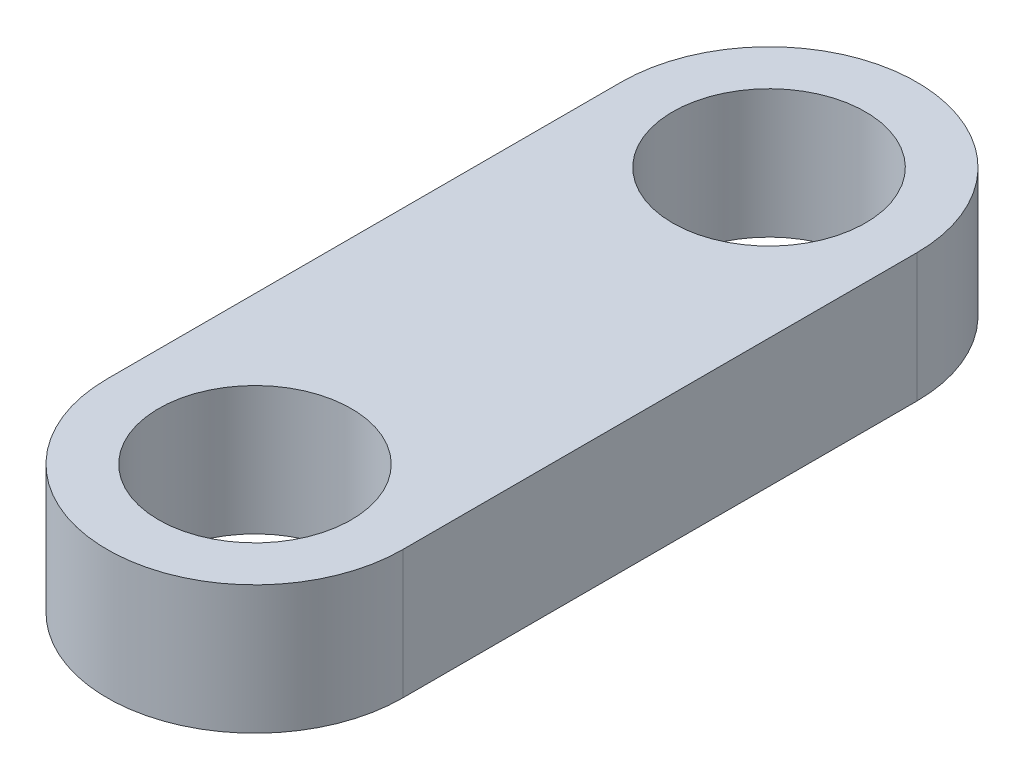
ISO-10303-21;
HEADER;
FILE_DESCRIPTION(('STEP AP214'),'2;1');
FILE_NAME('part.step','',(''),(''),'','','');
FILE_SCHEMA(('AUTOMOTIVE_DESIGN { 1 0 10303 214 1 1 1 1 }'));
ENDSEC;
DATA;
#1=APPLICATION_CONTEXT('core data for automotive mechanical design processes');
#2=APPLICATION_PROTOCOL_DEFINITION('international standard','automotive_design',2000,#1);
#3=PRODUCT_CONTEXT('',#1,'mechanical');
#4=PRODUCT('Part','Part','',(#3));
#5=PRODUCT_RELATED_PRODUCT_CATEGORY('part','',(#4));
#6=PRODUCT_DEFINITION_FORMATION('','',#4);
#7=PRODUCT_DEFINITION_CONTEXT('part definition',#1,'design');
#8=PRODUCT_DEFINITION('design','',#6,#7);
#9=PRODUCT_DEFINITION_SHAPE('','',#8);
#10=(LENGTH_UNIT() NAMED_UNIT(*) SI_UNIT(.MILLI.,.METRE.));
#11=(NAMED_UNIT(*) PLANE_ANGLE_UNIT() SI_UNIT($,.RADIAN.));
#12=(NAMED_UNIT(*) SI_UNIT($,.STERADIAN.) SOLID_ANGLE_UNIT());
#13=UNCERTAINTY_MEASURE_WITH_UNIT(LENGTH_MEASURE(1.E-05),#10,'distance_accuracy_value','');
#14=(GEOMETRIC_REPRESENTATION_CONTEXT(3) GLOBAL_UNCERTAINTY_ASSIGNED_CONTEXT((#13)) GLOBAL_UNIT_ASSIGNED_CONTEXT((#10,
#11,#12)) REPRESENTATION_CONTEXT('',''));
#15=CARTESIAN_POINT('',(0.,0.,0.));
#16=DIRECTION('',(0.,0.,1.));
#17=DIRECTION('',(1.,0.,0.));
#18=AXIS2_PLACEMENT_3D('',#15,#16,#17);
#19=CARTESIAN_POINT('',(0.,5.,0.));
#20=DIRECTION('',(0.,1.,0.));
#21=DIRECTION('',(0.,0.,1.));
#22=AXIS2_PLACEMENT_3D('',#19,#20,#21);
#23=PLANE('',#22);
#24=DIRECTION('',(0.,0.,1.));
#25=VECTOR('',#24,1.);
#26=CARTESIAN_POINT('',(5.75,5.,0.));
#27=LINE('',#26,#25);
#28=CARTESIAN_POINT('',(5.75,5.,-20.));
#29=VERTEX_POINT('',#28);
#30=CARTESIAN_POINT('',(5.75,5.,0.));
#31=VERTEX_POINT('',#30);
#32=EDGE_CURVE('E112',#29,#31,#27,.T.);
#33=ORIENTED_EDGE('',*,*,#32,.F.);
#34=CARTESIAN_POINT('',(0.,5.,-20.));
#35=DIRECTION('',(0.,1.,0.));
#36=DIRECTION('',(0.,0.,1.));
#37=AXIS2_PLACEMENT_3D('',#34,#35,#36);
#38=CIRCLE('',#37,5.75);
#39=CARTESIAN_POINT('',(-5.75,5.,-20.));
#40=VERTEX_POINT('',#39);
#41=EDGE_CURVE('E107',#29,#40,#38,.T.);
#42=ORIENTED_EDGE('',*,*,#41,.T.);
#43=DIRECTION('',(0.,0.,-1.));
#44=VECTOR('',#43,1.);
#45=CARTESIAN_POINT('',(-5.75,5.,0.));
#46=LINE('',#45,#44);
#47=CARTESIAN_POINT('',(-5.75,5.,0.));
#48=VERTEX_POINT('',#47);
#49=EDGE_CURVE('E111',#48,#40,#46,.T.);
#50=ORIENTED_EDGE('',*,*,#49,.F.);
#51=CARTESIAN_POINT('',(0.,5.,0.));
#52=DIRECTION('',(0.,1.,0.));
#53=DIRECTION('',(0.,0.,1.));
#54=AXIS2_PLACEMENT_3D('',#51,#52,#53);
#55=CIRCLE('',#54,5.75);
#56=EDGE_CURVE('E80',#48,#31,#55,.T.);
#57=ORIENTED_EDGE('',*,*,#56,.T.);
#58=EDGE_LOOP('',(#33,#42,#50,#57));
#59=FACE_BOUND('',#58,.T.);
#60=CARTESIAN_POINT('',(0.,5.,-20.));
#61=DIRECTION('',(0.,1.,0.));
#62=DIRECTION('',(0.,0.,1.));
#63=AXIS2_PLACEMENT_3D('',#60,#61,#62);
#64=CIRCLE('',#63,3.75);
#65=CARTESIAN_POINT('',(0.,5.,-16.25));
#66=VERTEX_POINT('',#65);
#67=EDGE_CURVE('E148',#66,#66,#64,.T.);
#68=ORIENTED_EDGE('',*,*,#67,.F.);
#69=EDGE_LOOP('',(#68));
#70=FACE_BOUND('',#69,.T.);
#71=CARTESIAN_POINT('',(0.,5.,0.));
#72=DIRECTION('',(0.,1.,0.));
#73=DIRECTION('',(0.,0.,1.));
#74=AXIS2_PLACEMENT_3D('',#71,#72,#73);
#75=CIRCLE('',#74,3.75);
#76=CARTESIAN_POINT('',(0.,5.,3.75));
#77=VERTEX_POINT('',#76);
#78=EDGE_CURVE('E136',#77,#77,#75,.T.);
#79=ORIENTED_EDGE('',*,*,#78,.F.);
#80=EDGE_LOOP('',(#79));
#81=FACE_BOUND('',#80,.T.);
#82=ADVANCED_FACE('F62',(#59,#70,#81),#23,.T.);
#83=CARTESIAN_POINT('',(0.,0.,0.));
#84=DIRECTION('',(0.,1.,0.));
#85=DIRECTION('',(0.,0.,1.));
#86=AXIS2_PLACEMENT_3D('',#83,#84,#85);
#87=PLANE('',#86);
#88=CARTESIAN_POINT('',(0.,0.,-20.));
#89=DIRECTION('',(0.,1.,0.));
#90=DIRECTION('',(0.,0.,1.));
#91=AXIS2_PLACEMENT_3D('',#88,#89,#90);
#92=CIRCLE('',#91,3.75);
#93=CARTESIAN_POINT('',(0.,0.,-16.25));
#94=VERTEX_POINT('',#93);
#95=EDGE_CURVE('E131',#94,#94,#92,.T.);
#96=ORIENTED_EDGE('',*,*,#95,.T.);
#97=EDGE_LOOP('',(#96));
#98=FACE_BOUND('',#97,.T.);
#99=DIRECTION('',(0.,0.,1.));
#100=VECTOR('',#99,1.);
#101=CARTESIAN_POINT('',(5.75,0.,0.));
#102=LINE('',#101,#100);
#103=CARTESIAN_POINT('',(5.75,0.,-20.));
#104=VERTEX_POINT('',#103);
#105=CARTESIAN_POINT('',(5.75,0.,0.));
#106=VERTEX_POINT('',#105);
#107=EDGE_CURVE('E135',#104,#106,#102,.T.);
#108=ORIENTED_EDGE('',*,*,#107,.T.);
#109=CARTESIAN_POINT('',(0.,0.,0.));
#110=DIRECTION('',(0.,1.,0.));
#111=DIRECTION('',(0.,0.,1.));
#112=AXIS2_PLACEMENT_3D('',#109,#110,#111);
#113=CIRCLE('',#112,5.75);
#114=CARTESIAN_POINT('',(-5.75,0.,0.));
#115=VERTEX_POINT('',#114);
#116=EDGE_CURVE('E145',#115,#106,#113,.T.);
#117=ORIENTED_EDGE('',*,*,#116,.F.);
#118=DIRECTION('',(0.,0.,-1.));
#119=VECTOR('',#118,1.);
#120=CARTESIAN_POINT('',(-5.75,0.,0.));
#121=LINE('',#120,#119);
#122=CARTESIAN_POINT('',(-5.75,0.,-20.));
#123=VERTEX_POINT('',#122);
#124=EDGE_CURVE('E142',#115,#123,#121,.T.);
#125=ORIENTED_EDGE('',*,*,#124,.T.);
#126=CARTESIAN_POINT('',(0.,0.,-20.));
#127=DIRECTION('',(0.,1.,0.));
#128=DIRECTION('',(0.,0.,1.));
#129=AXIS2_PLACEMENT_3D('',#126,#127,#128);
#130=CIRCLE('',#129,5.75);
#131=EDGE_CURVE('E119',#104,#123,#130,.T.);
#132=ORIENTED_EDGE('',*,*,#131,.F.);
#133=EDGE_LOOP('',(#108,#117,#125,#132));
#134=FACE_BOUND('',#133,.T.);
#135=CARTESIAN_POINT('',(0.,0.,0.));
#136=DIRECTION('',(0.,1.,0.));
#137=DIRECTION('',(0.,0.,1.));
#138=AXIS2_PLACEMENT_3D('',#135,#136,#137);
#139=CIRCLE('',#138,3.75);
#140=CARTESIAN_POINT('',(0.,0.,3.75));
#141=VERTEX_POINT('',#140);
#142=EDGE_CURVE('E159',#141,#141,#139,.T.);
#143=ORIENTED_EDGE('',*,*,#142,.T.);
#144=EDGE_LOOP('',(#143));
#145=FACE_BOUND('',#144,.T.);
#146=ADVANCED_FACE('F171',(#98,#134,#145),#87,.F.);
#147=CARTESIAN_POINT('',(5.75,5.,0.));
#148=DIRECTION('',(1.,0.,0.));
#149=DIRECTION('',(0.,0.,-1.));
#150=AXIS2_PLACEMENT_3D('',#147,#148,#149);
#151=PLANE('',#150);
#152=ORIENTED_EDGE('',*,*,#107,.F.);
#153=DIRECTION('',(0.,-1.,0.));
#154=VECTOR('',#153,1.);
#155=CARTESIAN_POINT('',(5.75,5.,-20.));
#156=LINE('',#155,#154);
#157=EDGE_CURVE('E12',#29,#104,#156,.T.);
#158=ORIENTED_EDGE('',*,*,#157,.F.);
#159=ORIENTED_EDGE('',*,*,#32,.T.);
#160=DIRECTION('',(0.,-1.,0.));
#161=VECTOR('',#160,1.);
#162=CARTESIAN_POINT('',(5.75,5.,0.));
#163=LINE('',#162,#161);
#164=EDGE_CURVE('E102',#31,#106,#163,.T.);
#165=ORIENTED_EDGE('',*,*,#164,.T.);
#166=EDGE_LOOP('',(#152,#158,#159,#165));
#167=FACE_BOUND('',#166,.T.);
#168=ADVANCED_FACE('F176',(#167),#151,.T.);
#169=CARTESIAN_POINT('',(0.,5.,-20.));
#170=DIRECTION('',(0.,-1.,0.));
#171=DIRECTION('',(0.,0.,-1.));
#172=AXIS2_PLACEMENT_3D('',#169,#170,#171);
#173=CYLINDRICAL_SURFACE('',#172,5.75);
#174=ORIENTED_EDGE('',*,*,#131,.T.);
#175=DIRECTION('',(0.,-1.,0.));
#176=VECTOR('',#175,1.);
#177=CARTESIAN_POINT('',(-5.75,5.,-20.));
#178=LINE('',#177,#176);
#179=EDGE_CURVE('E72',#40,#123,#178,.T.);
#180=ORIENTED_EDGE('',*,*,#179,.F.);
#181=ORIENTED_EDGE('',*,*,#41,.F.);
#182=ORIENTED_EDGE('',*,*,#157,.T.);
#183=EDGE_LOOP('',(#174,#180,#181,#182));
#184=FACE_BOUND('',#183,.T.);
#185=ADVANCED_FACE('F117',(#184),#173,.T.);
#186=CARTESIAN_POINT('',(-5.75,5.,0.));
#187=DIRECTION('',(-1.,0.,0.));
#188=DIRECTION('',(0.,0.,1.));
#189=AXIS2_PLACEMENT_3D('',#186,#187,#188);
#190=PLANE('',#189);
#191=ORIENTED_EDGE('',*,*,#124,.F.);
#192=DIRECTION('',(0.,-1.,0.));
#193=VECTOR('',#192,1.);
#194=CARTESIAN_POINT('',(-5.75,5.,0.));
#195=LINE('',#194,#193);
#196=EDGE_CURVE('E95',#48,#115,#195,.T.);
#197=ORIENTED_EDGE('',*,*,#196,.F.);
#198=ORIENTED_EDGE('',*,*,#49,.T.);
#199=ORIENTED_EDGE('',*,*,#179,.T.);
#200=EDGE_LOOP('',(#191,#197,#198,#199));
#201=FACE_BOUND('',#200,.T.);
#202=ADVANCED_FACE('F124',(#201),#190,.T.);
#203=CARTESIAN_POINT('',(0.,5.,-20.));
#204=DIRECTION('',(0.,-1.,0.));
#205=DIRECTION('',(0.,0.,-1.));
#206=AXIS2_PLACEMENT_3D('',#203,#204,#205);
#207=CYLINDRICAL_SURFACE('',#206,3.75);
#208=ORIENTED_EDGE('',*,*,#67,.T.);
#209=EDGE_LOOP('',(#208));
#210=FACE_BOUND('',#209,.T.);
#211=ORIENTED_EDGE('',*,*,#95,.F.);
#212=EDGE_LOOP('',(#211));
#213=FACE_BOUND('',#212,.T.);
#214=ADVANCED_FACE('F64',(#210,#213),#207,.F.);
#215=CARTESIAN_POINT('',(0.,5.,0.));
#216=DIRECTION('',(0.,-1.,0.));
#217=DIRECTION('',(0.,0.,-1.));
#218=AXIS2_PLACEMENT_3D('',#215,#216,#217);
#219=CYLINDRICAL_SURFACE('',#218,5.75);
#220=ORIENTED_EDGE('',*,*,#116,.T.);
#221=ORIENTED_EDGE('',*,*,#164,.F.);
#222=ORIENTED_EDGE('',*,*,#56,.F.);
#223=ORIENTED_EDGE('',*,*,#196,.T.);
#224=EDGE_LOOP('',(#220,#221,#222,#223));
#225=FACE_BOUND('',#224,.T.);
#226=ADVANCED_FACE('F181',(#225),#219,.T.);
#227=CARTESIAN_POINT('',(0.,5.,0.));
#228=DIRECTION('',(0.,-1.,0.));
#229=DIRECTION('',(0.,0.,-1.));
#230=AXIS2_PLACEMENT_3D('',#227,#228,#229);
#231=CYLINDRICAL_SURFACE('',#230,3.75);
#232=ORIENTED_EDGE('',*,*,#78,.T.);
#233=EDGE_LOOP('',(#232));
#234=FACE_BOUND('',#233,.T.);
#235=ORIENTED_EDGE('',*,*,#142,.F.);
#236=EDGE_LOOP('',(#235));
#237=FACE_BOUND('',#236,.T.);
#238=ADVANCED_FACE('F167',(#234,#237),#231,.F.);
#239=CLOSED_SHELL('',(#82,#146,#168,#185,#202,#214,#226,#238));
#240=MANIFOLD_SOLID_BREP('B2',#239);
#241=ADVANCED_BREP_SHAPE_REPRESENTATION('',(#18,#240),#14);
#242=SHAPE_DEFINITION_REPRESENTATION(#9,#241);
ENDSEC;
END-ISO-10303-21;
